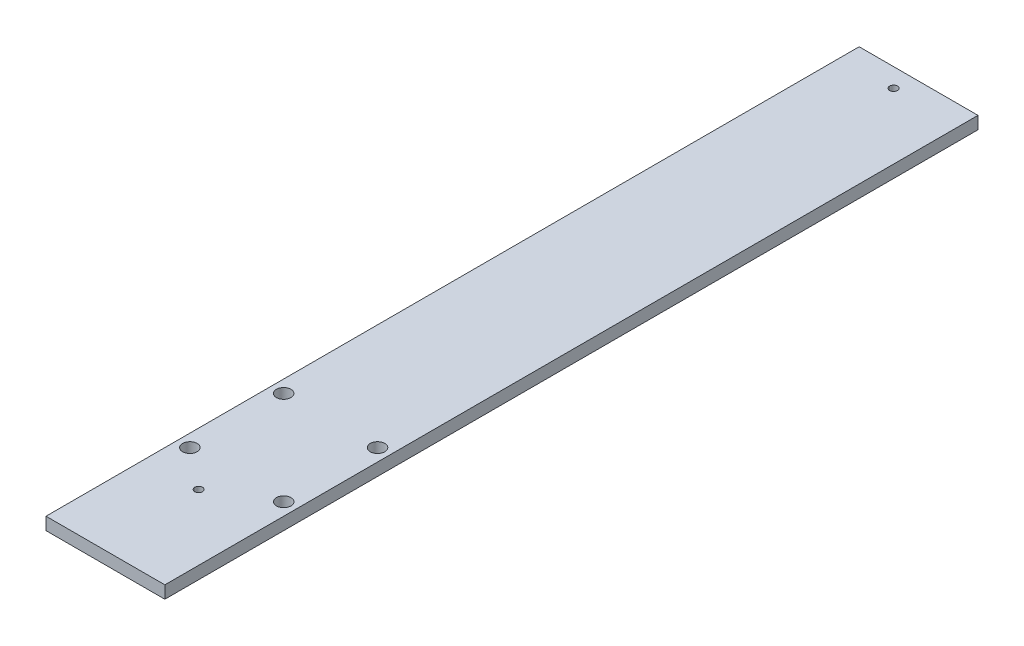
ISO-10303-21;
HEADER;
FILE_DESCRIPTION(('STEP AP214'),'2;1');
FILE_NAME('part.step','',(''),(''),'','','');
FILE_SCHEMA(('AUTOMOTIVE_DESIGN { 1 0 10303 214 1 1 1 1 }'));
ENDSEC;
DATA;
#1=APPLICATION_CONTEXT('core data for automotive mechanical design processes');
#2=APPLICATION_PROTOCOL_DEFINITION('international standard','automotive_design',2000,#1);
#3=PRODUCT_CONTEXT('',#1,'mechanical');
#4=PRODUCT('Part','Part','',(#3));
#5=PRODUCT_RELATED_PRODUCT_CATEGORY('part','',(#4));
#6=PRODUCT_DEFINITION_FORMATION('','',#4);
#7=PRODUCT_DEFINITION_CONTEXT('part definition',#1,'design');
#8=PRODUCT_DEFINITION('design','',#6,#7);
#9=PRODUCT_DEFINITION_SHAPE('','',#8);
#10=(LENGTH_UNIT() NAMED_UNIT(*) SI_UNIT(.MILLI.,.METRE.));
#11=(NAMED_UNIT(*) PLANE_ANGLE_UNIT() SI_UNIT($,.RADIAN.));
#12=(NAMED_UNIT(*) SI_UNIT($,.STERADIAN.) SOLID_ANGLE_UNIT());
#13=UNCERTAINTY_MEASURE_WITH_UNIT(LENGTH_MEASURE(1.E-05),#10,'distance_accuracy_value','');
#14=(GEOMETRIC_REPRESENTATION_CONTEXT(3) GLOBAL_UNCERTAINTY_ASSIGNED_CONTEXT((#13)) GLOBAL_UNIT_ASSIGNED_CONTEXT((#10,
#11,#12)) REPRESENTATION_CONTEXT('',''));
#15=CARTESIAN_POINT('',(0.,0.,0.));
#16=DIRECTION('',(0.,0.,1.));
#17=DIRECTION('',(1.,0.,0.));
#18=AXIS2_PLACEMENT_3D('',#15,#16,#17);
#19=CARTESIAN_POINT('',(107.95,0.,1449.0573));
#20=DIRECTION('',(0.,1.,0.));
#21=DIRECTION('',(0.,0.,1.));
#22=AXIS2_PLACEMENT_3D('',#19,#20,#21);
#23=CYLINDRICAL_SURFACE('',#22,7.93749999999992);
#24=DIRECTION('',(0.,1.,0.));
#25=VECTOR('',#24,1.);
#26=CARTESIAN_POINT('',(100.0125,0.,1449.0573));
#27=LINE('',#26,#25);
#28=CARTESIAN_POINT('',(100.0125,25.4,1449.0573));
#29=VERTEX_POINT('',#28);
#30=CARTESIAN_POINT('',(100.0125,0.,1449.0573));
#31=VERTEX_POINT('',#30);
#32=EDGE_CURVE('E11',#29,#31,#27,.F.);
#33=ORIENTED_EDGE('',*,*,#32,.F.);
#34=CARTESIAN_POINT('',(107.95,25.4,1449.0573));
#35=DIRECTION('',(0.,1.,0.));
#36=DIRECTION('',(0.,0.,1.));
#37=AXIS2_PLACEMENT_3D('',#34,#35,#36);
#38=CIRCLE('',#37,7.93749999999992);
#39=CARTESIAN_POINT('',(115.8875,25.4,1449.0573));
#40=VERTEX_POINT('',#39);
#41=EDGE_CURVE('E144',#29,#40,#38,.T.);
#42=ORIENTED_EDGE('',*,*,#41,.T.);
#43=DIRECTION('',(0.,1.,0.));
#44=VECTOR('',#43,1.);
#45=CARTESIAN_POINT('',(115.8875,0.,1449.0573));
#46=LINE('',#45,#44);
#47=CARTESIAN_POINT('',(115.8875,0.,1449.0573));
#48=VERTEX_POINT('',#47);
#49=EDGE_CURVE('E46',#48,#40,#46,.T.);
#50=ORIENTED_EDGE('',*,*,#49,.F.);
#51=CARTESIAN_POINT('',(107.95,0.,1449.0573));
#52=DIRECTION('',(0.,1.,0.));
#53=DIRECTION('',(0.,0.,1.));
#54=AXIS2_PLACEMENT_3D('',#51,#52,#53);
#55=CIRCLE('',#54,7.93749999999992);
#56=EDGE_CURVE('E230',#31,#48,#55,.T.);
#57=ORIENTED_EDGE('',*,*,#56,.F.);
#58=EDGE_LOOP('',(#33,#42,#50,#57));
#59=FACE_BOUND('',#58,.T.);
#60=ADVANCED_FACE('F37',(#59),#23,.F.);
#61=CARTESIAN_POINT('',(107.95,0.,38.1));
#62=DIRECTION('',(0.,1.,0.));
#63=DIRECTION('',(0.,0.,1.));
#64=AXIS2_PLACEMENT_3D('',#61,#62,#63);
#65=CYLINDRICAL_SURFACE('',#64,7.93749999999998);
#66=DIRECTION('',(0.,1.,0.));
#67=VECTOR('',#66,1.);
#68=CARTESIAN_POINT('',(100.0125,0.,38.1));
#69=LINE('',#68,#67);
#70=CARTESIAN_POINT('',(100.0125,25.4,38.1));
#71=VERTEX_POINT('',#70);
#72=CARTESIAN_POINT('',(100.0125,0.,38.1));
#73=VERTEX_POINT('',#72);
#74=EDGE_CURVE('E128',#71,#73,#69,.F.);
#75=ORIENTED_EDGE('',*,*,#74,.F.);
#76=CARTESIAN_POINT('',(107.95,25.4,38.1));
#77=DIRECTION('',(0.,1.,0.));
#78=DIRECTION('',(0.,0.,1.));
#79=AXIS2_PLACEMENT_3D('',#76,#77,#78);
#80=CIRCLE('',#79,7.93749999999998);
#81=CARTESIAN_POINT('',(115.8875,25.4,38.1));
#82=VERTEX_POINT('',#81);
#83=EDGE_CURVE('E156',#71,#82,#80,.T.);
#84=ORIENTED_EDGE('',*,*,#83,.T.);
#85=DIRECTION('',(0.,1.,0.));
#86=VECTOR('',#85,1.);
#87=CARTESIAN_POINT('',(115.8875,0.,38.1));
#88=LINE('',#87,#86);
#89=CARTESIAN_POINT('',(115.8875,0.,38.1));
#90=VERTEX_POINT('',#89);
#91=EDGE_CURVE('E125',#90,#82,#88,.T.);
#92=ORIENTED_EDGE('',*,*,#91,.F.);
#93=CARTESIAN_POINT('',(107.95,0.,38.1));
#94=DIRECTION('',(0.,1.,0.));
#95=DIRECTION('',(0.,0.,1.));
#96=AXIS2_PLACEMENT_3D('',#93,#94,#95);
#97=CIRCLE('',#96,7.93749999999998);
#98=EDGE_CURVE('E148',#73,#90,#97,.T.);
#99=ORIENTED_EDGE('',*,*,#98,.F.);
#100=EDGE_LOOP('',(#75,#84,#92,#99));
#101=FACE_BOUND('',#100,.T.);
#102=ADVANCED_FACE('F187',(#101),#65,.F.);
#103=CARTESIAN_POINT('',(0.,25.4,0.));
#104=DIRECTION('',(1.,0.,0.));
#105=DIRECTION('',(0.,0.,-1.));
#106=AXIS2_PLACEMENT_3D('',#103,#104,#105);
#107=PLANE('',#106);
#108=DIRECTION('',(0.,0.,1.));
#109=VECTOR('',#108,1.);
#110=CARTESIAN_POINT('',(0.,0.,0.));
#111=LINE('',#110,#109);
#112=CARTESIAN_POINT('',(0.,0.,0.));
#113=VERTEX_POINT('',#112);
#114=CARTESIAN_POINT('',(2.02189186539228E-13,0.,1651.));
#115=VERTEX_POINT('',#114);
#116=EDGE_CURVE('E124',#113,#115,#111,.T.);
#117=ORIENTED_EDGE('',*,*,#116,.T.);
#118=DIRECTION('',(0.,-1.,0.));
#119=VECTOR('',#118,1.);
#120=CARTESIAN_POINT('',(2.02189186539228E-13,25.4,1651.));
#121=LINE('',#120,#119);
#122=CARTESIAN_POINT('',(2.02189186539228E-13,25.4,1651.));
#123=VERTEX_POINT('',#122);
#124=EDGE_CURVE('E105',#123,#115,#121,.T.);
#125=ORIENTED_EDGE('',*,*,#124,.F.);
#126=DIRECTION('',(0.,0.,1.));
#127=VECTOR('',#126,1.);
#128=CARTESIAN_POINT('',(0.,25.4,0.));
#129=LINE('',#128,#127);
#130=CARTESIAN_POINT('',(0.,25.4,0.));
#131=VERTEX_POINT('',#130);
#132=EDGE_CURVE('E112',#131,#123,#129,.T.);
#133=ORIENTED_EDGE('',*,*,#132,.F.);
#134=DIRECTION('',(0.,-1.,0.));
#135=VECTOR('',#134,1.);
#136=CARTESIAN_POINT('',(0.,25.4,0.));
#137=LINE('',#136,#135);
#138=EDGE_CURVE('E162',#131,#113,#137,.T.);
#139=ORIENTED_EDGE('',*,*,#138,.T.);
#140=EDGE_LOOP('',(#117,#125,#133,#139));
#141=FACE_BOUND('',#140,.T.);
#142=ADVANCED_FACE('F39',(#141),#107,.F.);
#143=CARTESIAN_POINT('',(2.02189186539228E-13,25.4,1651.));
#144=DIRECTION('',(0.,0.,-1.));
#145=DIRECTION('',(-1.,0.,0.));
#146=AXIS2_PLACEMENT_3D('',#143,#144,#145);
#147=PLANE('',#146);
#148=DIRECTION('',(1.,0.,0.));
#149=VECTOR('',#148,1.);
#150=CARTESIAN_POINT('',(2.02189186539228E-13,0.,1651.));
#151=LINE('',#150,#149);
#152=CARTESIAN_POINT('',(241.3,0.,1651.));
#153=VERTEX_POINT('',#152);
#154=EDGE_CURVE('E164',#115,#153,#151,.T.);
#155=ORIENTED_EDGE('',*,*,#154,.T.);
#156=DIRECTION('',(0.,-1.,0.));
#157=VECTOR('',#156,1.);
#158=CARTESIAN_POINT('',(241.3,25.4,1651.));
#159=LINE('',#158,#157);
#160=CARTESIAN_POINT('',(241.3,25.4,1651.));
#161=VERTEX_POINT('',#160);
#162=EDGE_CURVE('E108',#161,#153,#159,.T.);
#163=ORIENTED_EDGE('',*,*,#162,.F.);
#164=DIRECTION('',(1.,0.,0.));
#165=VECTOR('',#164,1.);
#166=CARTESIAN_POINT('',(2.02189186539228E-13,25.4,1651.));
#167=LINE('',#166,#165);
#168=EDGE_CURVE('E101',#123,#161,#167,.T.);
#169=ORIENTED_EDGE('',*,*,#168,.F.);
#170=ORIENTED_EDGE('',*,*,#124,.T.);
#171=EDGE_LOOP('',(#155,#163,#169,#170));
#172=FACE_BOUND('',#171,.T.);
#173=ADVANCED_FACE('F103',(#172),#147,.F.);
#174=CARTESIAN_POINT('',(241.3,25.4,0.));
#175=DIRECTION('',(-1.,0.,0.));
#176=DIRECTION('',(0.,0.,1.));
#177=AXIS2_PLACEMENT_3D('',#174,#175,#176);
#178=PLANE('',#177);
#179=DIRECTION('',(0.,0.,-1.));
#180=VECTOR('',#179,1.);
#181=CARTESIAN_POINT('',(241.3,0.,0.));
#182=LINE('',#181,#180);
#183=CARTESIAN_POINT('',(241.3,0.,0.));
#184=VERTEX_POINT('',#183);
#185=EDGE_CURVE('E166',#153,#184,#182,.T.);
#186=ORIENTED_EDGE('',*,*,#185,.T.);
#187=DIRECTION('',(0.,-1.,0.));
#188=VECTOR('',#187,1.);
#189=CARTESIAN_POINT('',(241.3,25.4,0.));
#190=LINE('',#189,#188);
#191=CARTESIAN_POINT('',(241.3,25.4,0.));
#192=VERTEX_POINT('',#191);
#193=EDGE_CURVE('E130',#192,#184,#190,.T.);
#194=ORIENTED_EDGE('',*,*,#193,.F.);
#195=DIRECTION('',(0.,0.,-1.));
#196=VECTOR('',#195,1.);
#197=CARTESIAN_POINT('',(241.3,25.4,0.));
#198=LINE('',#197,#196);
#199=EDGE_CURVE('E111',#161,#192,#198,.T.);
#200=ORIENTED_EDGE('',*,*,#199,.F.);
#201=ORIENTED_EDGE('',*,*,#162,.T.);
#202=EDGE_LOOP('',(#186,#194,#200,#201));
#203=FACE_BOUND('',#202,.T.);
#204=ADVANCED_FACE('F178',(#203),#178,.F.);
#205=CARTESIAN_POINT('',(0.,25.4,0.));
#206=DIRECTION('',(0.,0.,1.));
#207=DIRECTION('',(1.,0.,0.));
#208=AXIS2_PLACEMENT_3D('',#205,#206,#207);
#209=PLANE('',#208);
#210=DIRECTION('',(-1.,0.,0.));
#211=VECTOR('',#210,1.);
#212=CARTESIAN_POINT('',(0.,0.,0.));
#213=LINE('',#212,#211);
#214=EDGE_CURVE('E121',#184,#113,#213,.T.);
#215=ORIENTED_EDGE('',*,*,#214,.T.);
#216=ORIENTED_EDGE('',*,*,#138,.F.);
#217=DIRECTION('',(-1.,0.,0.));
#218=VECTOR('',#217,1.);
#219=CARTESIAN_POINT('',(0.,25.4,0.));
#220=LINE('',#219,#218);
#221=EDGE_CURVE('E117',#192,#131,#220,.T.);
#222=ORIENTED_EDGE('',*,*,#221,.F.);
#223=ORIENTED_EDGE('',*,*,#193,.T.);
#224=EDGE_LOOP('',(#215,#216,#222,#223));
#225=FACE_BOUND('',#224,.T.);
#226=ADVANCED_FACE('F173',(#225),#209,.F.);
#227=CARTESIAN_POINT('',(0.,25.4,0.));
#228=DIRECTION('',(0.,1.,0.));
#229=DIRECTION('',(0.,0.,1.));
#230=AXIS2_PLACEMENT_3D('',#227,#228,#229);
#231=PLANE('',#230);
#232=CARTESIAN_POINT('',(25.4000000000002,25.4,1193.8));
#233=DIRECTION('',(0.,-1.,0.));
#234=DIRECTION('',(0.,0.,-1.));
#235=AXIS2_PLACEMENT_3D('',#232,#233,#234);
#236=CIRCLE('',#235,14.72946);
#237=CARTESIAN_POINT('',(25.4000000000002,25.4,1179.07054));
#238=VERTEX_POINT('',#237);
#239=EDGE_CURVE('E218',#238,#238,#236,.T.);
#240=ORIENTED_EDGE('',*,*,#239,.T.);
#241=EDGE_LOOP('',(#240));
#242=FACE_BOUND('',#241,.T.);
#243=CARTESIAN_POINT('',(25.4000000000002,25.4,1384.3));
#244=DIRECTION('',(0.,-1.,0.));
#245=DIRECTION('',(0.,0.,-1.));
#246=AXIS2_PLACEMENT_3D('',#243,#244,#245);
#247=CIRCLE('',#246,14.7294599999999);
#248=CARTESIAN_POINT('',(25.4000000000002,25.4,1369.57054));
#249=VERTEX_POINT('',#248);
#250=EDGE_CURVE('E222',#249,#249,#247,.T.);
#251=ORIENTED_EDGE('',*,*,#250,.T.);
#252=EDGE_LOOP('',(#251));
#253=FACE_BOUND('',#252,.T.);
#254=CARTESIAN_POINT('',(215.9,25.4,1384.3));
#255=DIRECTION('',(0.,-1.,0.));
#256=DIRECTION('',(0.,0.,-1.));
#257=AXIS2_PLACEMENT_3D('',#254,#255,#256);
#258=CIRCLE('',#257,14.72946);
#259=CARTESIAN_POINT('',(215.9,25.4,1369.57054));
#260=VERTEX_POINT('',#259);
#261=EDGE_CURVE('E226',#260,#260,#258,.T.);
#262=ORIENTED_EDGE('',*,*,#261,.T.);
#263=EDGE_LOOP('',(#262));
#264=FACE_BOUND('',#263,.T.);
#265=CARTESIAN_POINT('',(215.9,25.4,1193.8));
#266=DIRECTION('',(0.,-1.,0.));
#267=DIRECTION('',(0.,0.,-1.));
#268=AXIS2_PLACEMENT_3D('',#265,#266,#267);
#269=CIRCLE('',#268,14.7294599999999);
#270=CARTESIAN_POINT('',(215.9,25.4,1179.07054));
#271=VERTEX_POINT('',#270);
#272=EDGE_CURVE('E229',#271,#271,#269,.T.);
#273=ORIENTED_EDGE('',*,*,#272,.T.);
#274=EDGE_LOOP('',(#273));
#275=FACE_BOUND('',#274,.T.);
#276=EDGE_CURVE('E140',#40,#29,#38,.T.);
#277=ORIENTED_EDGE('',*,*,#276,.F.);
#278=ORIENTED_EDGE('',*,*,#41,.F.);
#279=EDGE_LOOP('',(#277,#278));
#280=FACE_BOUND('',#279,.T.);
#281=EDGE_CURVE('E157',#82,#71,#80,.T.);
#282=ORIENTED_EDGE('',*,*,#281,.F.);
#283=ORIENTED_EDGE('',*,*,#83,.F.);
#284=EDGE_LOOP('',(#282,#283));
#285=FACE_BOUND('',#284,.T.);
#286=ORIENTED_EDGE('',*,*,#132,.T.);
#287=ORIENTED_EDGE('',*,*,#168,.T.);
#288=ORIENTED_EDGE('',*,*,#199,.T.);
#289=ORIENTED_EDGE('',*,*,#221,.T.);
#290=EDGE_LOOP('',(#286,#287,#288,#289));
#291=FACE_BOUND('',#290,.T.);
#292=ADVANCED_FACE('F115',(#242,#253,#264,#275,#280,#285,#291),#231,.T.);
#293=CARTESIAN_POINT('',(0.,0.,0.));
#294=DIRECTION('',(0.,1.,0.));
#295=DIRECTION('',(0.,0.,1.));
#296=AXIS2_PLACEMENT_3D('',#293,#294,#295);
#297=PLANE('',#296);
#298=CARTESIAN_POINT('',(25.4000000000002,0.,1193.8));
#299=DIRECTION('',(0.,-1.,0.));
#300=DIRECTION('',(0.,0.,-1.));
#301=AXIS2_PLACEMENT_3D('',#298,#299,#300);
#302=CIRCLE('',#301,14.72946);
#303=CARTESIAN_POINT('',(25.4000000000002,0.,1179.07054));
#304=VERTEX_POINT('',#303);
#305=EDGE_CURVE('E243',#304,#304,#302,.T.);
#306=ORIENTED_EDGE('',*,*,#305,.F.);
#307=EDGE_LOOP('',(#306));
#308=FACE_BOUND('',#307,.T.);
#309=CARTESIAN_POINT('',(25.4000000000002,0.,1384.3));
#310=DIRECTION('',(0.,-1.,0.));
#311=DIRECTION('',(0.,0.,-1.));
#312=AXIS2_PLACEMENT_3D('',#309,#310,#311);
#313=CIRCLE('',#312,14.7294599999999);
#314=CARTESIAN_POINT('',(25.4000000000002,0.,1369.57054));
#315=VERTEX_POINT('',#314);
#316=EDGE_CURVE('E239',#315,#315,#313,.T.);
#317=ORIENTED_EDGE('',*,*,#316,.F.);
#318=EDGE_LOOP('',(#317));
#319=FACE_BOUND('',#318,.T.);
#320=CARTESIAN_POINT('',(215.9,0.,1384.3));
#321=DIRECTION('',(0.,-1.,0.));
#322=DIRECTION('',(0.,0.,-1.));
#323=AXIS2_PLACEMENT_3D('',#320,#321,#322);
#324=CIRCLE('',#323,14.72946);
#325=CARTESIAN_POINT('',(215.9,0.,1369.57054));
#326=VERTEX_POINT('',#325);
#327=EDGE_CURVE('E235',#326,#326,#324,.T.);
#328=ORIENTED_EDGE('',*,*,#327,.F.);
#329=EDGE_LOOP('',(#328));
#330=FACE_BOUND('',#329,.T.);
#331=CARTESIAN_POINT('',(215.9,0.,1193.8));
#332=DIRECTION('',(0.,-1.,0.));
#333=DIRECTION('',(0.,0.,-1.));
#334=AXIS2_PLACEMENT_3D('',#331,#332,#333);
#335=CIRCLE('',#334,14.7294599999999);
#336=CARTESIAN_POINT('',(215.9,0.,1179.07054));
#337=VERTEX_POINT('',#336);
#338=EDGE_CURVE('E231',#337,#337,#335,.T.);
#339=ORIENTED_EDGE('',*,*,#338,.F.);
#340=EDGE_LOOP('',(#339));
#341=FACE_BOUND('',#340,.T.);
#342=EDGE_CURVE('E142',#48,#31,#55,.T.);
#343=ORIENTED_EDGE('',*,*,#342,.T.);
#344=ORIENTED_EDGE('',*,*,#56,.T.);
#345=EDGE_LOOP('',(#343,#344));
#346=FACE_BOUND('',#345,.T.);
#347=EDGE_CURVE('E150',#90,#73,#97,.T.);
#348=ORIENTED_EDGE('',*,*,#347,.T.);
#349=ORIENTED_EDGE('',*,*,#98,.T.);
#350=EDGE_LOOP('',(#348,#349));
#351=FACE_BOUND('',#350,.T.);
#352=ORIENTED_EDGE('',*,*,#116,.F.);
#353=ORIENTED_EDGE('',*,*,#214,.F.);
#354=ORIENTED_EDGE('',*,*,#185,.F.);
#355=ORIENTED_EDGE('',*,*,#154,.F.);
#356=EDGE_LOOP('',(#352,#353,#354,#355));
#357=FACE_BOUND('',#356,.T.);
#358=ADVANCED_FACE('F177',(#308,#319,#330,#341,#346,#351,#357),#297,.F.);
#359=ORIENTED_EDGE('',*,*,#281,.T.);
#360=ORIENTED_EDGE('',*,*,#74,.T.);
#361=ORIENTED_EDGE('',*,*,#347,.F.);
#362=ORIENTED_EDGE('',*,*,#91,.T.);
#363=EDGE_LOOP('',(#359,#360,#361,#362));
#364=FACE_BOUND('',#363,.T.);
#365=ADVANCED_FACE('F194',(#364),#65,.F.);
#366=ORIENTED_EDGE('',*,*,#276,.T.);
#367=ORIENTED_EDGE('',*,*,#32,.T.);
#368=ORIENTED_EDGE('',*,*,#342,.F.);
#369=ORIENTED_EDGE('',*,*,#49,.T.);
#370=EDGE_LOOP('',(#366,#367,#368,#369));
#371=FACE_BOUND('',#370,.T.);
#372=ADVANCED_FACE('F138',(#371),#23,.F.);
#373=CARTESIAN_POINT('',(215.9,25.4,1193.8));
#374=DIRECTION('',(0.,-1.,0.));
#375=DIRECTION('',(0.,0.,-1.));
#376=AXIS2_PLACEMENT_3D('',#373,#374,#375);
#377=CYLINDRICAL_SURFACE('',#376,14.7294599999999);
#378=ORIENTED_EDGE('',*,*,#272,.F.);
#379=EDGE_LOOP('',(#378));
#380=FACE_BOUND('',#379,.T.);
#381=ORIENTED_EDGE('',*,*,#338,.T.);
#382=EDGE_LOOP('',(#381));
#383=FACE_BOUND('',#382,.T.);
#384=ADVANCED_FACE('F197',(#380,#383),#377,.F.);
#385=CARTESIAN_POINT('',(215.9,25.4,1384.3));
#386=DIRECTION('',(0.,-1.,0.));
#387=DIRECTION('',(0.,0.,-1.));
#388=AXIS2_PLACEMENT_3D('',#385,#386,#387);
#389=CYLINDRICAL_SURFACE('',#388,14.72946);
#390=ORIENTED_EDGE('',*,*,#261,.F.);
#391=EDGE_LOOP('',(#390));
#392=FACE_BOUND('',#391,.T.);
#393=ORIENTED_EDGE('',*,*,#327,.T.);
#394=EDGE_LOOP('',(#393));
#395=FACE_BOUND('',#394,.T.);
#396=ADVANCED_FACE('F202',(#392,#395),#389,.F.);
#397=CARTESIAN_POINT('',(25.4000000000002,25.4,1384.3));
#398=DIRECTION('',(0.,-1.,0.));
#399=DIRECTION('',(0.,0.,-1.));
#400=AXIS2_PLACEMENT_3D('',#397,#398,#399);
#401=CYLINDRICAL_SURFACE('',#400,14.7294599999999);
#402=ORIENTED_EDGE('',*,*,#250,.F.);
#403=EDGE_LOOP('',(#402));
#404=FACE_BOUND('',#403,.T.);
#405=ORIENTED_EDGE('',*,*,#316,.T.);
#406=EDGE_LOOP('',(#405));
#407=FACE_BOUND('',#406,.T.);
#408=ADVANCED_FACE('F265',(#404,#407),#401,.F.);
#409=CARTESIAN_POINT('',(25.4000000000002,25.4,1193.8));
#410=DIRECTION('',(0.,-1.,0.));
#411=DIRECTION('',(0.,0.,-1.));
#412=AXIS2_PLACEMENT_3D('',#409,#410,#411);
#413=CYLINDRICAL_SURFACE('',#412,14.72946);
#414=ORIENTED_EDGE('',*,*,#239,.F.);
#415=EDGE_LOOP('',(#414));
#416=FACE_BOUND('',#415,.T.);
#417=ORIENTED_EDGE('',*,*,#305,.T.);
#418=EDGE_LOOP('',(#417));
#419=FACE_BOUND('',#418,.T.);
#420=ADVANCED_FACE('F248',(#416,#419),#413,.F.);
#421=CLOSED_SHELL('',(#60,#102,#142,#173,#204,#226,#292,#358,#365,#372,#384,#396,#408,#420));
#422=MANIFOLD_SOLID_BREP('B2',#421);
#423=ADVANCED_BREP_SHAPE_REPRESENTATION('',(#18,#422),#14);
#424=SHAPE_DEFINITION_REPRESENTATION(#9,#423);
ENDSEC;
END-ISO-10303-21;
